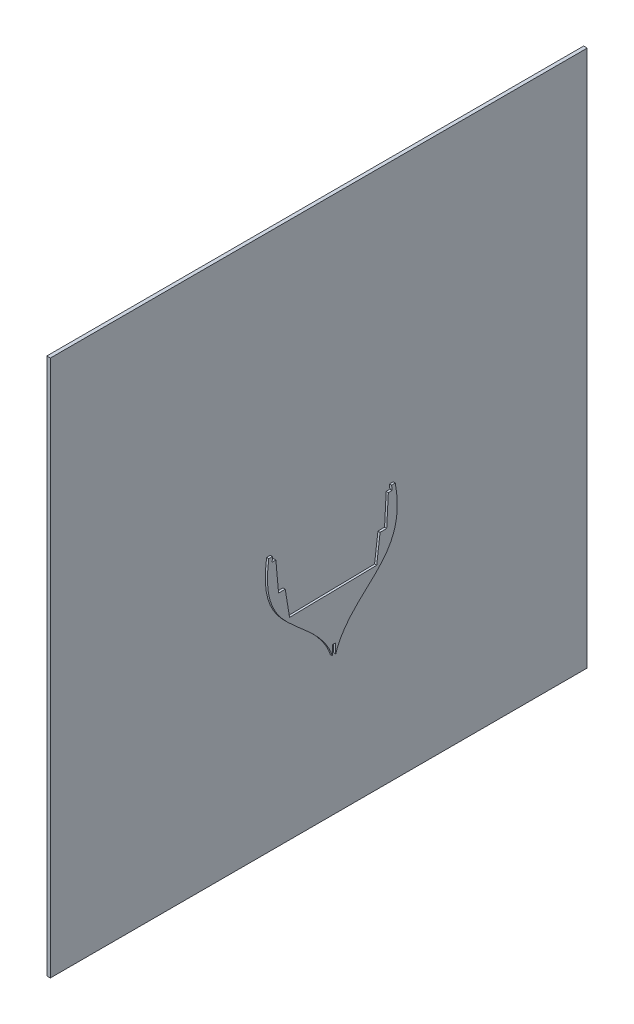
ISO-10303-21;
HEADER;
FILE_DESCRIPTION(('STEP AP214'),'2;1');
FILE_NAME('part.step','',(''),(''),'','','');
FILE_SCHEMA(('AUTOMOTIVE_DESIGN { 1 0 10303 214 1 1 1 1 }'));
ENDSEC;
DATA;
#1=APPLICATION_CONTEXT('core data for automotive mechanical design processes');
#2=APPLICATION_PROTOCOL_DEFINITION('international standard','automotive_design',2000,#1);
#3=PRODUCT_CONTEXT('',#1,'mechanical');
#4=PRODUCT('Part','Part','',(#3));
#5=PRODUCT_RELATED_PRODUCT_CATEGORY('part','',(#4));
#6=PRODUCT_DEFINITION_FORMATION('','',#4);
#7=PRODUCT_DEFINITION_CONTEXT('part definition',#1,'design');
#8=PRODUCT_DEFINITION('design','',#6,#7);
#9=PRODUCT_DEFINITION_SHAPE('','',#8);
#10=(LENGTH_UNIT() NAMED_UNIT(*) SI_UNIT(.MILLI.,.METRE.));
#11=(NAMED_UNIT(*) PLANE_ANGLE_UNIT() SI_UNIT($,.RADIAN.));
#12=(NAMED_UNIT(*) SI_UNIT($,.STERADIAN.) SOLID_ANGLE_UNIT());
#13=UNCERTAINTY_MEASURE_WITH_UNIT(LENGTH_MEASURE(1.E-05),#10,'distance_accuracy_value','');
#14=(GEOMETRIC_REPRESENTATION_CONTEXT(3) GLOBAL_UNCERTAINTY_ASSIGNED_CONTEXT((#13)) GLOBAL_UNIT_ASSIGNED_CONTEXT((#10,
#11,#12)) REPRESENTATION_CONTEXT('',''));
#15=CARTESIAN_POINT('',(0.,0.,0.));
#16=DIRECTION('',(0.,0.,1.));
#17=DIRECTION('',(1.,0.,0.));
#18=AXIS2_PLACEMENT_3D('',#15,#16,#17);
#19=CARTESIAN_POINT('',(6.,346.673932641493,183.06002434531));
#20=CARTESIAN_POINT('',(6.,122.485347700049,216.476501703529));
#21=CARTESIAN_POINT('',(6.,169.749174539966,39.194079735068));
#22=CARTESIAN_POINT('',(6.,24.8349411051071,0.449894327244288));
#23=CARTESIAN_POINT('',(6.,0.,0.));
#24=B_SPLINE_CURVE_WITH_KNOTS('',4,(#19,#20,#21,#22,#23),.UNSPECIFIED.,.F.,.F.,(5,5),(0.,1.),.UNSPECIFIED.);
#25=DIRECTION('',(-1.,0.,0.));
#26=VECTOR('',#25,1.);
#27=SURFACE_OF_LINEAR_EXTRUSION('',#24,#26);
#28=CARTESIAN_POINT('',(0.,346.673932641493,183.06002434531));
#29=CARTESIAN_POINT('',(0.,122.485347700049,216.476501703529));
#30=CARTESIAN_POINT('',(0.,169.749174539966,39.194079735068));
#31=CARTESIAN_POINT('',(0.,24.8349411051071,0.449894327244288));
#32=CARTESIAN_POINT('',(0.,0.,0.));
#33=B_SPLINE_CURVE_WITH_KNOTS('',4,(#28,#29,#30,#31,#32),.UNSPECIFIED.,.F.,.F.,(5,5),(0.,1.),.UNSPECIFIED.);
#34=CARTESIAN_POINT('',(0.,346.673932641493,183.06002434531));
#35=VERTEX_POINT('',#34);
#36=CARTESIAN_POINT('',(0.,22.6946291442047,4.91259851964648));
#37=VERTEX_POINT('',#36);
#38=EDGE_CURVE('E191',#35,#37,#33,.T.);
#39=ORIENTED_EDGE('',*,*,#38,.T.);
#40=DIRECTION('',(1.,0.,0.));
#41=VECTOR('',#40,1.);
#42=CARTESIAN_POINT('',(0.,22.6946291442047,4.91259851964648));
#43=LINE('',#42,#41);
#44=CARTESIAN_POINT('',(6.,22.6946291442047,4.91259851964648));
#45=VERTEX_POINT('',#44);
#46=EDGE_CURVE('E197',#37,#45,#43,.T.);
#47=ORIENTED_EDGE('',*,*,#46,.T.);
#48=CARTESIAN_POINT('',(6.,346.673932641493,183.06002434531));
#49=VERTEX_POINT('',#48);
#50=EDGE_CURVE('E231',#49,#45,#24,.T.);
#51=ORIENTED_EDGE('',*,*,#50,.F.);
#52=DIRECTION('',(-1.,0.,0.));
#53=VECTOR('',#52,1.);
#54=CARTESIAN_POINT('',(6.,346.673932641493,183.06002434531));
#55=LINE('',#54,#53);
#56=EDGE_CURVE('E187',#49,#35,#55,.T.);
#57=ORIENTED_EDGE('',*,*,#56,.T.);
#58=EDGE_LOOP('',(#39,#47,#51,#57));
#59=FACE_BOUND('',#58,.T.);
#60=ADVANCED_FACE('F45',(#59),#27,.F.);
#61=CARTESIAN_POINT('',(6.,0.,0.));
#62=CARTESIAN_POINT('',(6.,24.8349411051071,0.449894327244202));
#63=CARTESIAN_POINT('',(6.,171.057364198182,-33.0202407145872));
#64=CARTESIAN_POINT('',(6.,130.2455167882,-211.898186749143));
#65=CARTESIAN_POINT('',(6.,353.07670045321,-170.383777641823));
#66=B_SPLINE_CURVE_WITH_KNOTS('',4,(#61,#62,#63,#64,#65),.UNSPECIFIED.,.F.,.F.,(5,5),(0.,1.),.UNSPECIFIED.);
#67=DIRECTION('',(-1.,0.,0.));
#68=VECTOR('',#67,1.);
#69=SURFACE_OF_LINEAR_EXTRUSION('',#66,#68);
#70=CARTESIAN_POINT('',(6.,22.8576675395068,-4.08740148035351));
#71=VERTEX_POINT('',#70);
#72=CARTESIAN_POINT('',(6.,353.07670045321,-170.383777641823));
#73=VERTEX_POINT('',#72);
#74=EDGE_CURVE('E128',#71,#73,#66,.T.);
#75=ORIENTED_EDGE('',*,*,#74,.F.);
#76=DIRECTION('',(1.,0.,0.));
#77=VECTOR('',#76,1.);
#78=CARTESIAN_POINT('',(0.,22.8576675395068,-4.08740148035351));
#79=LINE('',#78,#77);
#80=CARTESIAN_POINT('',(0.,22.8576675395068,-4.08740148035351));
#81=VERTEX_POINT('',#80);
#82=EDGE_CURVE('E323',#81,#71,#79,.T.);
#83=ORIENTED_EDGE('',*,*,#82,.F.);
#84=CARTESIAN_POINT('',(0.,0.,0.));
#85=CARTESIAN_POINT('',(0.,24.8349411051071,0.449894327244202));
#86=CARTESIAN_POINT('',(0.,171.057364198182,-33.0202407145872));
#87=CARTESIAN_POINT('',(0.,130.2455167882,-211.898186749143));
#88=CARTESIAN_POINT('',(0.,353.07670045321,-170.383777641823));
#89=B_SPLINE_CURVE_WITH_KNOTS('',4,(#84,#85,#86,#87,#88),.UNSPECIFIED.,.F.,.F.,(5,5),(0.,1.),.UNSPECIFIED.);
#90=CARTESIAN_POINT('',(0.,353.07670045321,-170.383777641823));
#91=VERTEX_POINT('',#90);
#92=EDGE_CURVE('E196',#81,#91,#89,.T.);
#93=ORIENTED_EDGE('',*,*,#92,.T.);
#94=DIRECTION('',(-1.,0.,0.));
#95=VECTOR('',#94,1.);
#96=CARTESIAN_POINT('',(6.,353.07670045321,-170.383777641823));
#97=LINE('',#96,#95);
#98=EDGE_CURVE('E13',#73,#91,#97,.T.);
#99=ORIENTED_EDGE('',*,*,#98,.F.);
#100=EDGE_LOOP('',(#75,#83,#93,#99));
#101=FACE_BOUND('',#100,.T.);
#102=ADVANCED_FACE('F335',(#101),#69,.F.);
#103=CARTESIAN_POINT('',(6.,353.07670045321,-170.383777641823));
#104=DIRECTION('',(0.,-0.999835956927465,-0.0181124055536444));
#105=DIRECTION('',(0.,0.0181124055536444,-0.999835956927465));
#106=AXIS2_PLACEMENT_3D('',#103,#104,#105);
#107=PLANE('',#106);
#108=DIRECTION('',(0.,-0.0181124055536444,0.999835956927465));
#109=VECTOR('',#108,1.);
#110=CARTESIAN_POINT('',(0.,353.07670045321,-170.383777641823));
#111=LINE('',#110,#109);
#112=CARTESIAN_POINT('',(0.,352.895546680652,-160.383777641823));
#113=VERTEX_POINT('',#112);
#114=EDGE_CURVE('E204',#91,#113,#111,.T.);
#115=ORIENTED_EDGE('',*,*,#114,.T.);
#116=DIRECTION('',(-1.,0.,0.));
#117=VECTOR('',#116,1.);
#118=CARTESIAN_POINT('',(6.,352.895546680652,-160.383777641823));
#119=LINE('',#118,#117);
#120=CARTESIAN_POINT('',(6.,352.895546680652,-160.383777641823));
#121=VERTEX_POINT('',#120);
#122=EDGE_CURVE('E53',#121,#113,#119,.T.);
#123=ORIENTED_EDGE('',*,*,#122,.F.);
#124=DIRECTION('',(0.,-0.0181124055536444,0.999835956927465));
#125=VECTOR('',#124,1.);
#126=CARTESIAN_POINT('',(6.,353.07670045321,-170.383777641823));
#127=LINE('',#126,#125);
#128=EDGE_CURVE('E317',#73,#121,#127,.T.);
#129=ORIENTED_EDGE('',*,*,#128,.F.);
#130=ORIENTED_EDGE('',*,*,#98,.T.);
#131=EDGE_LOOP('',(#115,#123,#129,#130));
#132=FACE_BOUND('',#131,.T.);
#133=ADVANCED_FACE('F338',(#132),#107,.F.);
#134=CARTESIAN_POINT('',(6.,352.895546680652,-160.383777641823));
#135=DIRECTION('',(0.,0.0615422827320701,-0.998104477214748));
#136=DIRECTION('',(0.,0.998104477214748,0.0615422827320701));
#137=AXIS2_PLACEMENT_3D('',#134,#135,#136);
#138=PLANE('',#137);
#139=DIRECTION('',(0.,-0.998104477214748,-0.0615422827320701));
#140=VECTOR('',#139,1.);
#141=CARTESIAN_POINT('',(0.,352.895546680652,-160.383777641823));
#142=LINE('',#141,#140);
#143=CARTESIAN_POINT('',(0.,339.764558330323,-161.193423341302));
#144=VERTEX_POINT('',#143);
#145=EDGE_CURVE('E209',#113,#144,#142,.T.);
#146=ORIENTED_EDGE('',*,*,#145,.T.);
#147=DIRECTION('',(-1.,0.,0.));
#148=VECTOR('',#147,1.);
#149=CARTESIAN_POINT('',(6.,339.764558330323,-161.193423341302));
#150=LINE('',#149,#148);
#151=CARTESIAN_POINT('',(6.,339.764558330323,-161.193423341302));
#152=VERTEX_POINT('',#151);
#153=EDGE_CURVE('E256',#152,#144,#150,.T.);
#154=ORIENTED_EDGE('',*,*,#153,.F.);
#155=DIRECTION('',(0.,-0.998104477214748,-0.0615422827320701));
#156=VECTOR('',#155,1.);
#157=CARTESIAN_POINT('',(6.,352.895546680652,-160.383777641823));
#158=LINE('',#157,#156);
#159=EDGE_CURVE('E265',#121,#152,#158,.T.);
#160=ORIENTED_EDGE('',*,*,#159,.F.);
#161=ORIENTED_EDGE('',*,*,#122,.T.);
#162=EDGE_LOOP('',(#146,#154,#160,#161));
#163=FACE_BOUND('',#162,.T.);
#164=ADVANCED_FACE('F263',(#163),#138,.F.);
#165=CARTESIAN_POINT('',(6.,339.764558330323,-161.193423341302));
#166=DIRECTION('',(0.,-0.999835956927465,-0.0181124055536563));
#167=DIRECTION('',(0.,0.0181124055536563,-0.999835956927465));
#168=AXIS2_PLACEMENT_3D('',#165,#166,#167);
#169=PLANE('',#168);
#170=DIRECTION('',(0.,-0.0181124055536563,0.999835956927465));
#171=VECTOR('',#170,1.);
#172=CARTESIAN_POINT('',(0.,339.764558330323,-161.193423341302));
#173=LINE('',#172,#171);
#174=CARTESIAN_POINT('',(0.,339.580236130428,-151.018520699586));
#175=VERTEX_POINT('',#174);
#176=EDGE_CURVE('E211',#144,#175,#173,.T.);
#177=ORIENTED_EDGE('',*,*,#176,.T.);
#178=DIRECTION('',(-1.,0.,0.));
#179=VECTOR('',#178,1.);
#180=CARTESIAN_POINT('',(6.,339.580236130428,-151.018520699586));
#181=LINE('',#180,#179);
#182=CARTESIAN_POINT('',(6.,339.580236130428,-151.018520699586));
#183=VERTEX_POINT('',#182);
#184=EDGE_CURVE('E253',#183,#175,#181,.T.);
#185=ORIENTED_EDGE('',*,*,#184,.F.);
#186=DIRECTION('',(0.,-0.0181124055536563,0.999835956927465));
#187=VECTOR('',#186,1.);
#188=CARTESIAN_POINT('',(6.,339.764558330323,-161.193423341302));
#189=LINE('',#188,#187);
#190=EDGE_CURVE('E287',#152,#183,#189,.T.);
#191=ORIENTED_EDGE('',*,*,#190,.F.);
#192=ORIENTED_EDGE('',*,*,#153,.T.);
#193=EDGE_LOOP('',(#177,#185,#191,#192));
#194=FACE_BOUND('',#193,.T.);
#195=ADVANCED_FACE('F278',(#194),#169,.F.);
#196=CARTESIAN_POINT('',(6.,339.580236130428,-151.018520699586));
#197=DIRECTION('',(0.,-0.0538390916893999,-0.998549624308207));
#198=DIRECTION('',(0.,0.998549624308207,-0.0538390916893999));
#199=AXIS2_PLACEMENT_3D('',#196,#197,#198);
#200=PLANE('',#199);
#201=DIRECTION('',(0.,-0.998549624308206,0.0538390916893999));
#202=VECTOR('',#201,1.);
#203=CARTESIAN_POINT('',(0.,339.580236130428,-151.018520699586));
#204=LINE('',#203,#202);
#205=CARTESIAN_POINT('',(0.,255.274664597182,-146.47299258039));
#206=VERTEX_POINT('',#205);
#207=EDGE_CURVE('E213',#175,#206,#204,.T.);
#208=ORIENTED_EDGE('',*,*,#207,.T.);
#209=DIRECTION('',(-1.,0.,0.));
#210=VECTOR('',#209,1.);
#211=CARTESIAN_POINT('',(6.,255.274664597182,-146.47299258039));
#212=LINE('',#211,#210);
#213=CARTESIAN_POINT('',(6.,255.274664597182,-146.47299258039));
#214=VERTEX_POINT('',#213);
#215=EDGE_CURVE('E250',#214,#206,#212,.T.);
#216=ORIENTED_EDGE('',*,*,#215,.F.);
#217=DIRECTION('',(0.,-0.998549624308206,0.0538390916893999));
#218=VECTOR('',#217,1.);
#219=CARTESIAN_POINT('',(6.,339.580236130428,-151.018520699586));
#220=LINE('',#219,#218);
#221=EDGE_CURVE('E284',#183,#214,#220,.T.);
#222=ORIENTED_EDGE('',*,*,#221,.F.);
#223=ORIENTED_EDGE('',*,*,#184,.T.);
#224=EDGE_LOOP('',(#208,#216,#222,#223));
#225=FACE_BOUND('',#224,.T.);
#226=ADVANCED_FACE('F282',(#225),#200,.F.);
#227=CARTESIAN_POINT('',(6.,255.274664597182,-146.47299258039));
#228=DIRECTION('',(0.,-0.999835956927465,-0.0181124055536453));
#229=DIRECTION('',(0.,0.0181124055536453,-0.999835956927465));
#230=AXIS2_PLACEMENT_3D('',#227,#228,#229);
#231=PLANE('',#230);
#232=DIRECTION('',(0.,-0.0181124055536454,0.999835956927465));
#233=VECTOR('',#232,1.);
#234=CARTESIAN_POINT('',(0.,255.274664597182,-146.47299258039));
#235=LINE('',#234,#233);
#236=CARTESIAN_POINT('',(0.,254.939924048743,-127.994738238122));
#237=VERTEX_POINT('',#236);
#238=EDGE_CURVE('E215',#206,#237,#235,.T.);
#239=ORIENTED_EDGE('',*,*,#238,.T.);
#240=DIRECTION('',(-1.,0.,0.));
#241=VECTOR('',#240,1.);
#242=CARTESIAN_POINT('',(6.,254.939924048743,-127.994738238122));
#243=LINE('',#242,#241);
#244=CARTESIAN_POINT('',(6.,254.939924048743,-127.994738238122));
#245=VERTEX_POINT('',#244);
#246=EDGE_CURVE('E247',#245,#237,#243,.T.);
#247=ORIENTED_EDGE('',*,*,#246,.F.);
#248=DIRECTION('',(0.,-0.0181124055536454,0.999835956927465));
#249=VECTOR('',#248,1.);
#250=CARTESIAN_POINT('',(6.,255.274664597182,-146.47299258039));
#251=LINE('',#250,#249);
#252=EDGE_CURVE('E286',#214,#245,#251,.T.);
#253=ORIENTED_EDGE('',*,*,#252,.F.);
#254=ORIENTED_EDGE('',*,*,#215,.T.);
#255=EDGE_LOOP('',(#239,#247,#253,#254));
#256=FACE_BOUND('',#255,.T.);
#257=ADVANCED_FACE('F348',(#256),#231,.F.);
#258=CARTESIAN_POINT('',(6.,254.939924048743,-127.994738238122));
#259=DIRECTION('',(0.,-0.125354503025121,-0.992112014125081));
#260=DIRECTION('',(0.,0.992112014125081,-0.125354503025121));
#261=AXIS2_PLACEMENT_3D('',#258,#259,#260);
#262=PLANE('',#261);
#263=DIRECTION('',(0.,-0.992112014125081,0.125354503025121));
#264=VECTOR('',#263,1.);
#265=CARTESIAN_POINT('',(0.,254.939924048743,-127.994738238122));
#266=LINE('',#265,#264);
#267=CARTESIAN_POINT('',(0.,180.005385852165,-118.526672474064));
#268=VERTEX_POINT('',#267);
#269=EDGE_CURVE('E217',#237,#268,#266,.T.);
#270=ORIENTED_EDGE('',*,*,#269,.T.);
#271=DIRECTION('',(-1.,0.,0.));
#272=VECTOR('',#271,1.);
#273=CARTESIAN_POINT('',(6.,180.005385852165,-118.526672474064));
#274=LINE('',#273,#272);
#275=CARTESIAN_POINT('',(6.,180.005385852165,-118.526672474064));
#276=VERTEX_POINT('',#275);
#277=EDGE_CURVE('E244',#276,#268,#274,.T.);
#278=ORIENTED_EDGE('',*,*,#277,.F.);
#279=DIRECTION('',(0.,-0.992112014125081,0.125354503025121));
#280=VECTOR('',#279,1.);
#281=CARTESIAN_POINT('',(6.,254.939924048743,-127.994738238122));
#282=LINE('',#281,#280);
#283=EDGE_CURVE('E289',#245,#276,#282,.T.);
#284=ORIENTED_EDGE('',*,*,#283,.F.);
#285=ORIENTED_EDGE('',*,*,#246,.T.);
#286=EDGE_LOOP('',(#270,#278,#284,#285));
#287=FACE_BOUND('',#286,.T.);
#288=ADVANCED_FACE('F351',(#287),#262,.F.);
#289=CARTESIAN_POINT('',(6.,180.005385852165,-118.526672474064));
#290=DIRECTION('',(0.,-0.999835956927465,-0.0181124055536429));
#291=DIRECTION('',(0.,0.0181124055536429,-0.999835956927466));
#292=AXIS2_PLACEMENT_3D('',#289,#290,#291);
#293=PLANE('',#292);
#294=DIRECTION('',(0.,-0.0181124055536429,0.999835956927465));
#295=VECTOR('',#294,1.);
#296=CARTESIAN_POINT('',(0.,180.005385852165,-118.526672474064));
#297=LINE('',#296,#295);
#298=CARTESIAN_POINT('',(0.,175.594379008655,124.968496366587));
#299=VERTEX_POINT('',#298);
#300=EDGE_CURVE('E219',#268,#299,#297,.T.);
#301=ORIENTED_EDGE('',*,*,#300,.T.);
#302=DIRECTION('',(-1.,0.,0.));
#303=VECTOR('',#302,1.);
#304=CARTESIAN_POINT('',(6.,175.594379008655,124.968496366587));
#305=LINE('',#304,#303);
#306=CARTESIAN_POINT('',(6.,175.594379008655,124.968496366587));
#307=VERTEX_POINT('',#306);
#308=EDGE_CURVE('E241',#307,#299,#305,.T.);
#309=ORIENTED_EDGE('',*,*,#308,.F.);
#310=DIRECTION('',(0.,-0.0181124055536429,0.999835956927465));
#311=VECTOR('',#310,1.);
#312=CARTESIAN_POINT('',(6.,180.005385852165,-118.526672474064));
#313=LINE('',#312,#311);
#314=EDGE_CURVE('E295',#276,#307,#313,.T.);
#315=ORIENTED_EDGE('',*,*,#314,.F.);
#316=ORIENTED_EDGE('',*,*,#277,.T.);
#317=EDGE_LOOP('',(#301,#309,#315,#316));
#318=FACE_BOUND('',#317,.T.);
#319=ADVANCED_FACE('F355',(#318),#293,.F.);
#320=CARTESIAN_POINT('',(6.,250.136828640148,137.14439415621));
#321=DIRECTION('',(0.,-0.161205430373838,0.986920872825165));
#322=DIRECTION('',(0.,-0.986920872825165,-0.161205430373838));
#323=AXIS2_PLACEMENT_3D('',#320,#321,#322);
#324=PLANE('',#323);
#325=DIRECTION('',(0.,0.986920872825165,0.161205430373838));
#326=VECTOR('',#325,1.);
#327=CARTESIAN_POINT('',(0.,250.136828640148,137.14439415621));
#328=LINE('',#327,#326);
#329=CARTESIAN_POINT('',(0.,250.136828640148,137.14439415621));
#330=VERTEX_POINT('',#329);
#331=EDGE_CURVE('E221',#299,#330,#328,.T.);
#332=ORIENTED_EDGE('',*,*,#331,.T.);
#333=DIRECTION('',(-1.,0.,0.));
#334=VECTOR('',#333,1.);
#335=CARTESIAN_POINT('',(6.,250.136828640148,137.14439415621));
#336=LINE('',#335,#334);
#337=CARTESIAN_POINT('',(6.,250.136828640148,137.14439415621));
#338=VERTEX_POINT('',#337);
#339=EDGE_CURVE('E238',#338,#330,#336,.T.);
#340=ORIENTED_EDGE('',*,*,#339,.F.);
#341=DIRECTION('',(0.,0.986920872825165,0.161205430373838));
#342=VECTOR('',#341,1.);
#343=CARTESIAN_POINT('',(6.,250.136828640148,137.14439415621));
#344=LINE('',#343,#342);
#345=EDGE_CURVE('E297',#307,#338,#344,.T.);
#346=ORIENTED_EDGE('',*,*,#345,.F.);
#347=ORIENTED_EDGE('',*,*,#308,.T.);
#348=EDGE_LOOP('',(#332,#340,#346,#347));
#349=FACE_BOUND('',#348,.T.);
#350=ADVANCED_FACE('F359',(#349),#324,.F.);
#351=CARTESIAN_POINT('',(6.,249.802088091709,155.622648498477));
#352=DIRECTION('',(0.,-0.999835956927465,-0.0181124055536441));
#353=DIRECTION('',(0.,0.0181124055536441,-0.999835956927465));
#354=AXIS2_PLACEMENT_3D('',#351,#352,#353);
#355=PLANE('',#354);
#356=DIRECTION('',(0.,-0.0181124055536441,0.999835956927465));
#357=VECTOR('',#356,1.);
#358=CARTESIAN_POINT('',(0.,249.802088091709,155.622648498477));
#359=LINE('',#358,#357);
#360=CARTESIAN_POINT('',(0.,249.802088091709,155.622648498477));
#361=VERTEX_POINT('',#360);
#362=EDGE_CURVE('E223',#330,#361,#359,.T.);
#363=ORIENTED_EDGE('',*,*,#362,.T.);
#364=DIRECTION('',(-1.,0.,0.));
#365=VECTOR('',#364,1.);
#366=CARTESIAN_POINT('',(6.,249.802088091709,155.622648498477));
#367=LINE('',#366,#365);
#368=CARTESIAN_POINT('',(6.,249.802088091709,155.622648498477));
#369=VERTEX_POINT('',#368);
#370=EDGE_CURVE('E235',#369,#361,#367,.T.);
#371=ORIENTED_EDGE('',*,*,#370,.F.);
#372=DIRECTION('',(0.,-0.0181124055536441,0.999835956927465));
#373=VECTOR('',#372,1.);
#374=CARTESIAN_POINT('',(6.,249.802088091709,155.622648498477));
#375=LINE('',#374,#373);
#376=EDGE_CURVE('E299',#338,#369,#375,.T.);
#377=ORIENTED_EDGE('',*,*,#376,.F.);
#378=ORIENTED_EDGE('',*,*,#339,.T.);
#379=EDGE_LOOP('',(#363,#371,#377,#378));
#380=FACE_BOUND('',#379,.T.);
#381=ADVANCED_FACE('F305',(#380),#355,.F.);
#382=CARTESIAN_POINT('',(6.,333.887711296337,163.218646636903));
#383=DIRECTION('',(0.,-0.0899701045781973,0.995944466464967));
#384=DIRECTION('',(0.,-0.995944466464967,-0.0899701045781973));
#385=AXIS2_PLACEMENT_3D('',#382,#383,#384);
#386=PLANE('',#385);
#387=DIRECTION('',(0.,0.995944466464967,0.0899701045781973));
#388=VECTOR('',#387,1.);
#389=CARTESIAN_POINT('',(0.,333.887711296337,163.218646636903));
#390=LINE('',#389,#388);
#391=CARTESIAN_POINT('',(0.,333.887711296337,163.218646636903));
#392=VERTEX_POINT('',#391);
#393=EDGE_CURVE('E225',#361,#392,#390,.T.);
#394=ORIENTED_EDGE('',*,*,#393,.T.);
#395=DIRECTION('',(-1.,0.,0.));
#396=VECTOR('',#395,1.);
#397=CARTESIAN_POINT('',(6.,333.887711296337,163.218646636903));
#398=LINE('',#397,#396);
#399=CARTESIAN_POINT('',(6.,333.887711296337,163.218646636903));
#400=VERTEX_POINT('',#399);
#401=EDGE_CURVE('E182',#400,#392,#398,.T.);
#402=ORIENTED_EDGE('',*,*,#401,.F.);
#403=DIRECTION('',(0.,0.995944466464967,0.0899701045781973));
#404=VECTOR('',#403,1.);
#405=CARTESIAN_POINT('',(6.,333.887711296337,163.218646636903));
#406=LINE('',#405,#404);
#407=EDGE_CURVE('E170',#369,#400,#406,.T.);
#408=ORIENTED_EDGE('',*,*,#407,.F.);
#409=ORIENTED_EDGE('',*,*,#370,.T.);
#410=EDGE_LOOP('',(#394,#402,#408,#409));
#411=FACE_BOUND('',#410,.T.);
#412=ADVANCED_FACE('F309',(#411),#386,.F.);
#413=CARTESIAN_POINT('',(6.,333.703389096441,173.393549278619));
#414=DIRECTION('',(0.,-0.999835956927465,-0.0181124055536398));
#415=DIRECTION('',(0.,0.0181124055536398,-0.999835956927466));
#416=AXIS2_PLACEMENT_3D('',#413,#414,#415);
#417=PLANE('',#416);
#418=DIRECTION('',(0.,-0.0181124055536398,0.999835956927466));
#419=VECTOR('',#418,1.);
#420=CARTESIAN_POINT('',(0.,333.703389096441,173.393549278619));
#421=LINE('',#420,#419);
#422=CARTESIAN_POINT('',(0.,333.703389096441,173.393549278619));
#423=VERTEX_POINT('',#422);
#424=EDGE_CURVE('E179',#392,#423,#421,.T.);
#425=ORIENTED_EDGE('',*,*,#424,.T.);
#426=DIRECTION('',(-1.,0.,0.));
#427=VECTOR('',#426,1.);
#428=CARTESIAN_POINT('',(6.,333.703389096441,173.393549278619));
#429=LINE('',#428,#427);
#430=CARTESIAN_POINT('',(6.,333.703389096441,173.393549278619));
#431=VERTEX_POINT('',#430);
#432=EDGE_CURVE('E176',#431,#423,#429,.T.);
#433=ORIENTED_EDGE('',*,*,#432,.F.);
#434=DIRECTION('',(0.,-0.0181124055536398,0.999835956927466));
#435=VECTOR('',#434,1.);
#436=CARTESIAN_POINT('',(6.,333.703389096441,173.393549278619));
#437=LINE('',#436,#435);
#438=EDGE_CURVE('E163',#400,#431,#437,.T.);
#439=ORIENTED_EDGE('',*,*,#438,.F.);
#440=ORIENTED_EDGE('',*,*,#401,.T.);
#441=EDGE_LOOP('',(#425,#433,#439,#440));
#442=FACE_BOUND('',#441,.T.);
#443=ADVANCED_FACE('F177',(#442),#417,.F.);
#444=CARTESIAN_POINT('',(6.,346.855086414051,173.06002434531));
#445=DIRECTION('',(0.,0.0253516887165534,0.999678594288794));
#446=DIRECTION('',(0.,-0.999678594288794,0.0253516887165534));
#447=AXIS2_PLACEMENT_3D('',#444,#445,#446);
#448=PLANE('',#447);
#449=DIRECTION('',(0.,0.999678594288794,-0.0253516887165533));
#450=VECTOR('',#449,1.);
#451=CARTESIAN_POINT('',(0.,346.855086414051,173.06002434531));
#452=LINE('',#451,#450);
#453=CARTESIAN_POINT('',(0.,346.855086414051,173.06002434531));
#454=VERTEX_POINT('',#453);
#455=EDGE_CURVE('E228',#423,#454,#452,.T.);
#456=ORIENTED_EDGE('',*,*,#455,.T.);
#457=DIRECTION('',(-1.,0.,0.));
#458=VECTOR('',#457,1.);
#459=CARTESIAN_POINT('',(6.,346.855086414051,173.06002434531));
#460=LINE('',#459,#458);
#461=CARTESIAN_POINT('',(6.,346.855086414051,173.06002434531));
#462=VERTEX_POINT('',#461);
#463=EDGE_CURVE('E183',#462,#454,#460,.T.);
#464=ORIENTED_EDGE('',*,*,#463,.F.);
#465=DIRECTION('',(0.,0.999678594288794,-0.0253516887165533));
#466=VECTOR('',#465,1.);
#467=CARTESIAN_POINT('',(6.,346.855086414051,173.06002434531));
#468=LINE('',#467,#466);
#469=EDGE_CURVE('E167',#431,#462,#468,.T.);
#470=ORIENTED_EDGE('',*,*,#469,.F.);
#471=ORIENTED_EDGE('',*,*,#432,.T.);
#472=EDGE_LOOP('',(#456,#464,#470,#471));
#473=FACE_BOUND('',#472,.T.);
#474=ADVANCED_FACE('F185',(#473),#448,.F.);
#475=CARTESIAN_POINT('',(6.,346.673932641493,183.06002434531));
#476=DIRECTION('',(0.,-0.999835956927465,-0.0181124055536504));
#477=DIRECTION('',(0.,0.0181124055536504,-0.999835956927465));
#478=AXIS2_PLACEMENT_3D('',#475,#476,#477);
#479=PLANE('',#478);
#480=DIRECTION('',(0.,-0.0181124055536504,0.999835956927465));
#481=VECTOR('',#480,1.);
#482=CARTESIAN_POINT('',(0.,346.673932641493,183.06002434531));
#483=LINE('',#482,#481);
#484=EDGE_CURVE('E120',#454,#35,#483,.T.);
#485=ORIENTED_EDGE('',*,*,#484,.T.);
#486=ORIENTED_EDGE('',*,*,#56,.F.);
#487=DIRECTION('',(0.,-0.0181124055536504,0.999835956927465));
#488=VECTOR('',#487,1.);
#489=CARTESIAN_POINT('',(6.,346.673932641493,183.06002434531));
#490=LINE('',#489,#488);
#491=EDGE_CURVE('E69',#462,#49,#490,.T.);
#492=ORIENTED_EDGE('',*,*,#491,.F.);
#493=ORIENTED_EDGE('',*,*,#463,.T.);
#494=EDGE_LOOP('',(#485,#486,#492,#493));
#495=FACE_BOUND('',#494,.T.);
#496=ADVANCED_FACE('F311',(#495),#479,.F.);
#497=CARTESIAN_POINT('',(6.,122.15313344387,80.3706304299256));
#498=DIRECTION('',(-1.,0.,0.));
#499=DIRECTION('',(0.,0.,1.));
#500=AXIS2_PLACEMENT_3D('',#497,#498,#499);
#501=PLANE('',#500);
#502=ORIENTED_EDGE('',*,*,#50,.T.);
#503=DIRECTION('',(0.,-0.999835956927465,-0.0181124055536429));
#504=VECTOR('',#503,1.);
#505=CARTESIAN_POINT('',(6.,22.6946291442047,4.91259851964648));
#506=LINE('',#505,#504);
#507=CARTESIAN_POINT('',(6.,49.6946291442047,5.40171370555276));
#508=VERTEX_POINT('',#507);
#509=EDGE_CURVE('E511',#508,#45,#506,.T.);
#510=ORIENTED_EDGE('',*,*,#509,.F.);
#511=DIRECTION('',(0.,-0.0181124055536438,0.999835956927465));
#512=VECTOR('',#511,1.);
#513=CARTESIAN_POINT('',(6.,49.6946291442047,5.40171370555276));
#514=LINE('',#513,#512);
#515=CARTESIAN_POINT('',(6.,49.8576675395068,-3.59828629444724));
#516=VERTEX_POINT('',#515);
#517=EDGE_CURVE('E519',#516,#508,#514,.T.);
#518=ORIENTED_EDGE('',*,*,#517,.F.);
#519=DIRECTION('',(0.,0.999835956927465,0.0181124055536428));
#520=VECTOR('',#519,1.);
#521=CARTESIAN_POINT('',(6.,49.8576675395068,-3.59828629444724));
#522=LINE('',#521,#520);
#523=EDGE_CURVE('E523',#71,#516,#522,.T.);
#524=ORIENTED_EDGE('',*,*,#523,.F.);
#525=ORIENTED_EDGE('',*,*,#74,.T.);
#526=ORIENTED_EDGE('',*,*,#128,.T.);
#527=ORIENTED_EDGE('',*,*,#159,.T.);
#528=ORIENTED_EDGE('',*,*,#190,.T.);
#529=ORIENTED_EDGE('',*,*,#221,.T.);
#530=ORIENTED_EDGE('',*,*,#252,.T.);
#531=ORIENTED_EDGE('',*,*,#283,.T.);
#532=ORIENTED_EDGE('',*,*,#314,.T.);
#533=ORIENTED_EDGE('',*,*,#345,.T.);
#534=ORIENTED_EDGE('',*,*,#376,.T.);
#535=ORIENTED_EDGE('',*,*,#407,.T.);
#536=ORIENTED_EDGE('',*,*,#438,.T.);
#537=ORIENTED_EDGE('',*,*,#469,.T.);
#538=ORIENTED_EDGE('',*,*,#491,.T.);
#539=EDGE_LOOP('',(#502,#510,#518,#524,#525,#526,#527,#528,#529,#530,#531,#532,#533,#534,#535,
#536,#537,#538));
#540=FACE_BOUND('',#539,.T.);
#541=ADVANCED_FACE('F165',(#540),#501,.F.);
#542=CARTESIAN_POINT('',(0.,122.15313344387,80.3706304299256));
#543=DIRECTION('',(-1.,0.,0.));
#544=DIRECTION('',(0.,0.,1.));
#545=AXIS2_PLACEMENT_3D('',#542,#543,#544);
#546=PLANE('',#545);
#547=DIRECTION('',(0.,-0.999835956927465,-0.0181124055536429));
#548=VECTOR('',#547,1.);
#549=CARTESIAN_POINT('',(0.,22.6946291442047,4.91259851964648));
#550=LINE('',#549,#548);
#551=CARTESIAN_POINT('',(0.,49.6946291442047,5.40171370555276));
#552=VERTEX_POINT('',#551);
#553=EDGE_CURVE('E532',#552,#37,#550,.T.);
#554=ORIENTED_EDGE('',*,*,#553,.T.);
#555=ORIENTED_EDGE('',*,*,#38,.F.);
#556=ORIENTED_EDGE('',*,*,#484,.F.);
#557=ORIENTED_EDGE('',*,*,#455,.F.);
#558=ORIENTED_EDGE('',*,*,#424,.F.);
#559=ORIENTED_EDGE('',*,*,#393,.F.);
#560=ORIENTED_EDGE('',*,*,#362,.F.);
#561=ORIENTED_EDGE('',*,*,#331,.F.);
#562=ORIENTED_EDGE('',*,*,#300,.F.);
#563=ORIENTED_EDGE('',*,*,#269,.F.);
#564=ORIENTED_EDGE('',*,*,#238,.F.);
#565=ORIENTED_EDGE('',*,*,#207,.F.);
#566=ORIENTED_EDGE('',*,*,#176,.F.);
#567=ORIENTED_EDGE('',*,*,#145,.F.);
#568=ORIENTED_EDGE('',*,*,#114,.F.);
#569=ORIENTED_EDGE('',*,*,#92,.F.);
#570=DIRECTION('',(0.,0.999835956927465,0.0181124055536428));
#571=VECTOR('',#570,1.);
#572=CARTESIAN_POINT('',(0.,49.8576675395068,-3.59828629444724));
#573=LINE('',#572,#571);
#574=CARTESIAN_POINT('',(0.,49.8576675395068,-3.59828629444724));
#575=VERTEX_POINT('',#574);
#576=EDGE_CURVE('E518',#81,#575,#573,.T.);
#577=ORIENTED_EDGE('',*,*,#576,.T.);
#578=DIRECTION('',(0.,-0.0181124055536438,0.999835956927465));
#579=VECTOR('',#578,1.);
#580=CARTESIAN_POINT('',(0.,49.6946291442047,5.40171370555276));
#581=LINE('',#580,#579);
#582=EDGE_CURVE('E60',#575,#552,#581,.T.);
#583=ORIENTED_EDGE('',*,*,#582,.T.);
#584=EDGE_LOOP('',(#554,#555,#556,#557,#558,#559,#560,#561,#562,#563,#564,#565,#566,#567,#568,
#569,#577,#583));
#585=FACE_BOUND('',#584,.T.);
#586=ADVANCED_FACE('F272',(#585),#546,.T.);
#587=CARTESIAN_POINT('',(0.,22.6946291442047,4.91259851964648));
#588=DIRECTION('',(0.,-0.0181124055536429,0.999835956927465));
#589=DIRECTION('',(0.,-0.999835956927466,-0.0181124055536429));
#590=AXIS2_PLACEMENT_3D('',#587,#588,#589);
#591=PLANE('',#590);
#592=ORIENTED_EDGE('',*,*,#509,.T.);
#593=ORIENTED_EDGE('',*,*,#46,.F.);
#594=ORIENTED_EDGE('',*,*,#553,.F.);
#595=DIRECTION('',(1.,0.,0.));
#596=VECTOR('',#595,1.);
#597=CARTESIAN_POINT('',(0.,49.6946291442047,5.40171370555276));
#598=LINE('',#597,#596);
#599=EDGE_CURVE('E514',#552,#508,#598,.T.);
#600=ORIENTED_EDGE('',*,*,#599,.T.);
#601=EDGE_LOOP('',(#592,#593,#594,#600));
#602=FACE_BOUND('',#601,.T.);
#603=ADVANCED_FACE('F376',(#602),#591,.F.);
#604=CARTESIAN_POINT('',(0.,49.6946291442047,5.40171370555276));
#605=DIRECTION('',(0.,0.999835956927465,0.0181124055536438));
#606=DIRECTION('',(0.,-0.0181124055536438,0.999835956927466));
#607=AXIS2_PLACEMENT_3D('',#604,#605,#606);
#608=PLANE('',#607);
#609=ORIENTED_EDGE('',*,*,#517,.T.);
#610=ORIENTED_EDGE('',*,*,#599,.F.);
#611=ORIENTED_EDGE('',*,*,#582,.F.);
#612=DIRECTION('',(1.,0.,0.));
#613=VECTOR('',#612,1.);
#614=CARTESIAN_POINT('',(0.,49.8576675395068,-3.59828629444724));
#615=LINE('',#614,#613);
#616=EDGE_CURVE('E528',#575,#516,#615,.T.);
#617=ORIENTED_EDGE('',*,*,#616,.T.);
#618=EDGE_LOOP('',(#609,#610,#611,#617));
#619=FACE_BOUND('',#618,.T.);
#620=ADVANCED_FACE('F382',(#619),#608,.F.);
#621=CARTESIAN_POINT('',(0.,49.8576675395068,-3.59828629444724));
#622=DIRECTION('',(0.,0.0181124055536428,-0.999835956927465));
#623=DIRECTION('',(0.,0.999835956927466,0.0181124055536428));
#624=AXIS2_PLACEMENT_3D('',#621,#622,#623);
#625=PLANE('',#624);
#626=ORIENTED_EDGE('',*,*,#523,.T.);
#627=ORIENTED_EDGE('',*,*,#616,.F.);
#628=ORIENTED_EDGE('',*,*,#576,.F.);
#629=ORIENTED_EDGE('',*,*,#82,.T.);
#630=EDGE_LOOP('',(#626,#627,#628,#629));
#631=FACE_BOUND('',#630,.T.);
#632=ADVANCED_FACE('F379',(#631),#625,.F.);
#633=CLOSED_SHELL('',(#60,#102,#133,#164,#195,#226,#257,#288,#319,#350,#381,#412,#443,#474,#496,
#541,#586,#603,#620,#632));
#634=MANIFOLD_SOLID_BREP('B2',#633);
#635=CARTESIAN_POINT('',(-10.,0.,0.));
#636=DIRECTION('',(-1.,0.,0.));
#637=DIRECTION('',(0.,0.,1.));
#638=AXIS2_PLACEMENT_3D('',#635,#636,#637);
#639=PLANE('',#638);
#640=DIRECTION('',(0.,0.,-1.));
#641=VECTOR('',#640,1.);
#642=CARTESIAN_POINT('',(-10.,-378.710653275796,777.274991403029));
#643=LINE('',#642,#641);
#644=CARTESIAN_POINT('',(-10.,-378.710653275796,777.274991403029));
#645=VERTEX_POINT('',#644);
#646=CARTESIAN_POINT('',(-10.,-378.710653275796,-722.725008596971));
#647=VERTEX_POINT('',#646);
#648=EDGE_CURVE('E565',#645,#647,#643,.T.);
#649=ORIENTED_EDGE('',*,*,#648,.T.);
#650=DIRECTION('',(0.,-1.,0.));
#651=VECTOR('',#650,1.);
#652=CARTESIAN_POINT('',(-10.,1121.2893467242,-722.725008596971));
#653=LINE('',#652,#651);
#654=CARTESIAN_POINT('',(-10.,1121.2893467242,-722.725008596971));
#655=VERTEX_POINT('',#654);
#656=EDGE_CURVE('E599',#655,#647,#653,.T.);
#657=ORIENTED_EDGE('',*,*,#656,.F.);
#658=DIRECTION('',(0.,0.,-1.));
#659=VECTOR('',#658,1.);
#660=CARTESIAN_POINT('',(-10.,1121.2893467242,777.274991403029));
#661=LINE('',#660,#659);
#662=CARTESIAN_POINT('',(-10.,1121.2893467242,777.274991403029));
#663=VERTEX_POINT('',#662);
#664=EDGE_CURVE('E596',#663,#655,#661,.T.);
#665=ORIENTED_EDGE('',*,*,#664,.F.);
#666=DIRECTION('',(0.,-1.,0.));
#667=VECTOR('',#666,1.);
#668=CARTESIAN_POINT('',(-10.,1121.2893467242,777.274991403029));
#669=LINE('',#668,#667);
#670=EDGE_CURVE('E593',#663,#645,#669,.T.);
#671=ORIENTED_EDGE('',*,*,#670,.T.);
#672=EDGE_LOOP('',(#649,#657,#665,#671));
#673=FACE_BOUND('',#672,.T.);
#674=ADVANCED_FACE('F556',(#673),#639,.F.);
#675=CARTESIAN_POINT('',(-20.,0.,0.));
#676=DIRECTION('',(-1.,0.,0.));
#677=DIRECTION('',(0.,0.,1.));
#678=AXIS2_PLACEMENT_3D('',#675,#676,#677);
#679=PLANE('',#678);
#680=DIRECTION('',(0.,0.,-1.));
#681=VECTOR('',#680,1.);
#682=CARTESIAN_POINT('',(-20.,-378.710653275796,777.274991403029));
#683=LINE('',#682,#681);
#684=CARTESIAN_POINT('',(-20.,-378.710653275796,777.274991403029));
#685=VERTEX_POINT('',#684);
#686=CARTESIAN_POINT('',(-20.,-378.710653275796,-722.725008596971));
#687=VERTEX_POINT('',#686);
#688=EDGE_CURVE('E43',#685,#687,#683,.T.);
#689=ORIENTED_EDGE('',*,*,#688,.F.);
#690=DIRECTION('',(0.,-1.,0.));
#691=VECTOR('',#690,1.);
#692=CARTESIAN_POINT('',(-20.,1121.2893467242,777.274991403029));
#693=LINE('',#692,#691);
#694=CARTESIAN_POINT('',(-20.,1121.2893467242,777.274991403029));
#695=VERTEX_POINT('',#694);
#696=EDGE_CURVE('E612',#695,#685,#693,.T.);
#697=ORIENTED_EDGE('',*,*,#696,.F.);
#698=DIRECTION('',(0.,0.,-1.));
#699=VECTOR('',#698,1.);
#700=CARTESIAN_POINT('',(-20.,1121.2893467242,777.274991403029));
#701=LINE('',#700,#699);
#702=CARTESIAN_POINT('',(-20.,1121.2893467242,-722.725008596971));
#703=VERTEX_POINT('',#702);
#704=EDGE_CURVE('E603',#695,#703,#701,.T.);
#705=ORIENTED_EDGE('',*,*,#704,.T.);
#706=DIRECTION('',(0.,-1.,0.));
#707=VECTOR('',#706,1.);
#708=CARTESIAN_POINT('',(-20.,1121.2893467242,-722.725008596971));
#709=LINE('',#708,#707);
#710=EDGE_CURVE('E574',#703,#687,#709,.T.);
#711=ORIENTED_EDGE('',*,*,#710,.T.);
#712=EDGE_LOOP('',(#689,#697,#705,#711));
#713=FACE_BOUND('',#712,.T.);
#714=ADVANCED_FACE('F652',(#713),#679,.T.);
#715=CARTESIAN_POINT('',(-20.,1121.2893467242,777.274991403029));
#716=DIRECTION('',(0.,0.,1.));
#717=DIRECTION('',(1.,0.,0.));
#718=AXIS2_PLACEMENT_3D('',#715,#716,#717);
#719=PLANE('',#718);
#720=ORIENTED_EDGE('',*,*,#670,.F.);
#721=DIRECTION('',(1.,0.,0.));
#722=VECTOR('',#721,1.);
#723=CARTESIAN_POINT('',(-20.,1121.2893467242,777.274991403029));
#724=LINE('',#723,#722);
#725=EDGE_CURVE('E608',#695,#663,#724,.T.);
#726=ORIENTED_EDGE('',*,*,#725,.F.);
#727=ORIENTED_EDGE('',*,*,#696,.T.);
#728=DIRECTION('',(1.,0.,0.));
#729=VECTOR('',#728,1.);
#730=CARTESIAN_POINT('',(-20.,-378.710653275796,777.274991403029));
#731=LINE('',#730,#729);
#732=EDGE_CURVE('E604',#685,#645,#731,.T.);
#733=ORIENTED_EDGE('',*,*,#732,.T.);
#734=EDGE_LOOP('',(#720,#726,#727,#733));
#735=FACE_BOUND('',#734,.T.);
#736=ADVANCED_FACE('F613',(#735),#719,.T.);
#737=CARTESIAN_POINT('',(-20.,-378.710653275796,777.274991403029));
#738=DIRECTION('',(0.,-1.,0.));
#739=DIRECTION('',(0.,0.,-1.));
#740=AXIS2_PLACEMENT_3D('',#737,#738,#739);
#741=PLANE('',#740);
#742=ORIENTED_EDGE('',*,*,#648,.F.);
#743=ORIENTED_EDGE('',*,*,#732,.F.);
#744=ORIENTED_EDGE('',*,*,#688,.T.);
#745=DIRECTION('',(1.,0.,0.));
#746=VECTOR('',#745,1.);
#747=CARTESIAN_POINT('',(-20.,-378.710653275796,-722.725008596971));
#748=LINE('',#747,#746);
#749=EDGE_CURVE('E624',#687,#647,#748,.T.);
#750=ORIENTED_EDGE('',*,*,#749,.T.);
#751=EDGE_LOOP('',(#742,#743,#744,#750));
#752=FACE_BOUND('',#751,.T.);
#753=ADVANCED_FACE('F654',(#752),#741,.T.);
#754=CARTESIAN_POINT('',(-20.,1121.2893467242,777.274991403029));
#755=DIRECTION('',(0.,-1.,0.));
#756=DIRECTION('',(0.,0.,-1.));
#757=AXIS2_PLACEMENT_3D('',#754,#755,#756);
#758=PLANE('',#757);
#759=ORIENTED_EDGE('',*,*,#664,.T.);
#760=DIRECTION('',(1.,0.,0.));
#761=VECTOR('',#760,1.);
#762=CARTESIAN_POINT('',(-20.,1121.2893467242,-722.725008596971));
#763=LINE('',#762,#761);
#764=EDGE_CURVE('E628',#703,#655,#763,.T.);
#765=ORIENTED_EDGE('',*,*,#764,.F.);
#766=ORIENTED_EDGE('',*,*,#704,.F.);
#767=ORIENTED_EDGE('',*,*,#725,.T.);
#768=EDGE_LOOP('',(#759,#765,#766,#767));
#769=FACE_BOUND('',#768,.T.);
#770=ADVANCED_FACE('F609',(#769),#758,.F.);
#771=CARTESIAN_POINT('',(-20.,1121.2893467242,-722.725008596971));
#772=DIRECTION('',(0.,0.,1.));
#773=DIRECTION('',(1.,0.,0.));
#774=AXIS2_PLACEMENT_3D('',#771,#772,#773);
#775=PLANE('',#774);
#776=ORIENTED_EDGE('',*,*,#656,.T.);
#777=ORIENTED_EDGE('',*,*,#749,.F.);
#778=ORIENTED_EDGE('',*,*,#710,.F.);
#779=ORIENTED_EDGE('',*,*,#764,.T.);
#780=EDGE_LOOP('',(#776,#777,#778,#779));
#781=FACE_BOUND('',#780,.T.);
#782=ADVANCED_FACE('F639',(#781),#775,.F.);
#783=CLOSED_SHELL('',(#674,#714,#736,#753,#770,#782));
#784=MANIFOLD_SOLID_BREP('B7_NOT_SHOWN',#783);
#785=ADVANCED_BREP_SHAPE_REPRESENTATION('',(#18,#634,#784),#14);
#786=SHAPE_DEFINITION_REPRESENTATION(#9,#785);
ENDSEC;
END-ISO-10303-21;
